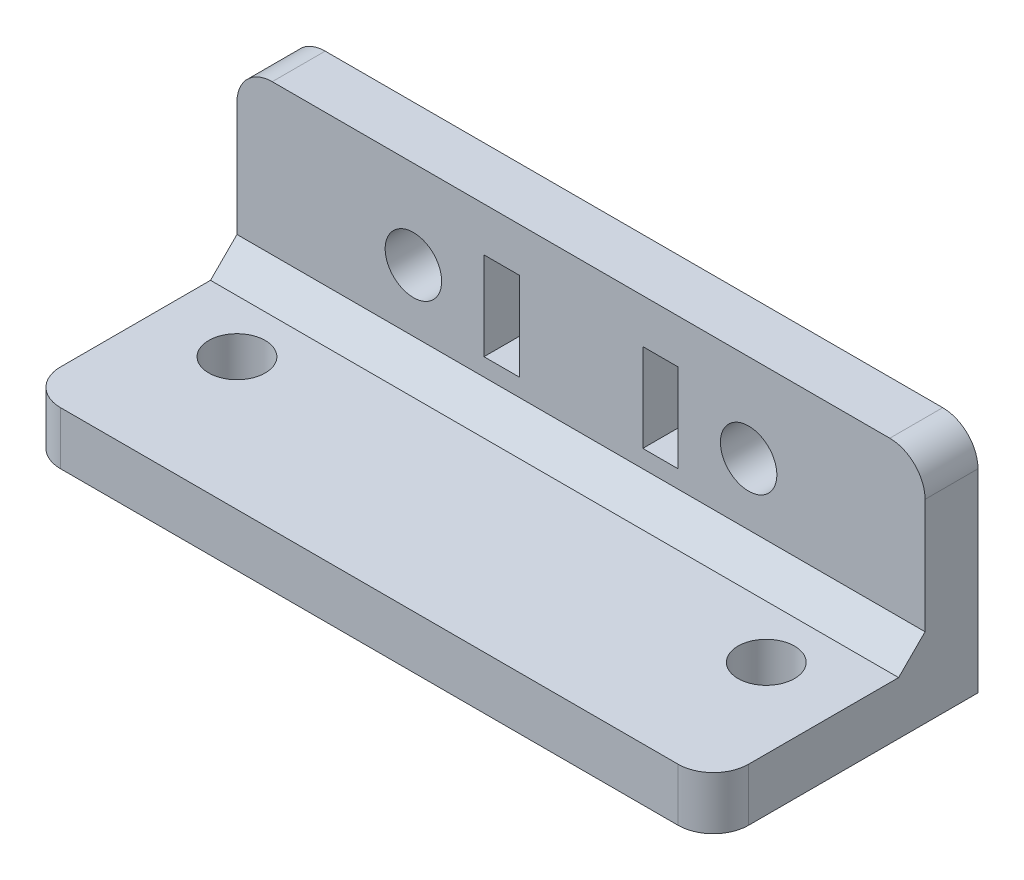
ISO-10303-21;
HEADER;
FILE_DESCRIPTION(('STEP AP214'),'2;1');
FILE_NAME('part.step','',(''),(''),'','','');
FILE_SCHEMA(('AUTOMOTIVE_DESIGN { 1 0 10303 214 1 1 1 1 }'));
ENDSEC;
DATA;
#1=APPLICATION_CONTEXT('core data for automotive mechanical design processes');
#2=APPLICATION_PROTOCOL_DEFINITION('international standard','automotive_design',2000,#1);
#3=PRODUCT_CONTEXT('',#1,'mechanical');
#4=PRODUCT('Part','Part','',(#3));
#5=PRODUCT_RELATED_PRODUCT_CATEGORY('part','',(#4));
#6=PRODUCT_DEFINITION_FORMATION('','',#4);
#7=PRODUCT_DEFINITION_CONTEXT('part definition',#1,'design');
#8=PRODUCT_DEFINITION('design','',#6,#7);
#9=PRODUCT_DEFINITION_SHAPE('','',#8);
#10=(LENGTH_UNIT() NAMED_UNIT(*) SI_UNIT(.MILLI.,.METRE.));
#11=(NAMED_UNIT(*) PLANE_ANGLE_UNIT() SI_UNIT($,.RADIAN.));
#12=(NAMED_UNIT(*) SI_UNIT($,.STERADIAN.) SOLID_ANGLE_UNIT());
#13=UNCERTAINTY_MEASURE_WITH_UNIT(LENGTH_MEASURE(1.E-05),#10,'distance_accuracy_value','');
#14=(GEOMETRIC_REPRESENTATION_CONTEXT(3) GLOBAL_UNCERTAINTY_ASSIGNED_CONTEXT((#13)) GLOBAL_UNIT_ASSIGNED_CONTEXT((#10,
#11,#12)) REPRESENTATION_CONTEXT('',''));
#15=CARTESIAN_POINT('',(0.,0.,0.));
#16=DIRECTION('',(0.,0.,1.));
#17=DIRECTION('',(1.,0.,0.));
#18=AXIS2_PLACEMENT_3D('',#15,#16,#17);
#19=CARTESIAN_POINT('',(0.,0.,3.));
#20=DIRECTION('',(0.,0.,1.));
#21=DIRECTION('',(1.,0.,0.));
#22=AXIS2_PLACEMENT_3D('',#19,#20,#21);
#23=PLANE('',#22);
#24=CARTESIAN_POINT('',(0.,0.,3.));
#25=DIRECTION('',(0.,0.,1.));
#26=DIRECTION('',(1.,0.,0.));
#27=AXIS2_PLACEMENT_3D('',#24,#25,#26);
#28=CIRCLE('',#27,1.6);
#29=CARTESIAN_POINT('',(1.6,0.,3.));
#30=VERTEX_POINT('',#29);
#31=EDGE_CURVE('E325',#30,#30,#28,.T.);
#32=ORIENTED_EDGE('',*,*,#31,.F.);
#33=EDGE_LOOP('',(#32));
#34=FACE_BOUND('',#33,.T.);
#35=DIRECTION('',(-1.,0.,0.));
#36=VECTOR('',#35,1.);
#37=CARTESIAN_POINT('',(-10.,5.,3.));
#38=LINE('',#37,#36);
#39=CARTESIAN_POINT('',(27.,4.99999999999999,3.));
#40=VERTEX_POINT('',#39);
#41=CARTESIAN_POINT('',(-8.,5.,3.));
#42=VERTEX_POINT('',#41);
#43=EDGE_CURVE('E332',#40,#42,#38,.T.);
#44=ORIENTED_EDGE('',*,*,#43,.T.);
#45=CARTESIAN_POINT('',(-8.,3.,3.));
#46=DIRECTION('',(0.,0.,1.));
#47=DIRECTION('',(1.,0.,0.));
#48=AXIS2_PLACEMENT_3D('',#45,#46,#47);
#49=CIRCLE('',#48,2.);
#50=CARTESIAN_POINT('',(-10.,3.,3.));
#51=VERTEX_POINT('',#50);
#52=EDGE_CURVE('E11',#42,#51,#49,.T.);
#53=ORIENTED_EDGE('',*,*,#52,.T.);
#54=DIRECTION('',(0.,-1.,0.));
#55=VECTOR('',#54,1.);
#56=CARTESIAN_POINT('',(-10.,-5.,3.));
#57=LINE('',#56,#55);
#58=CARTESIAN_POINT('',(-10.,-3.49999999999999,3.));
#59=VERTEX_POINT('',#58);
#60=EDGE_CURVE('E335',#51,#59,#57,.T.);
#61=ORIENTED_EDGE('',*,*,#60,.T.);
#62=DIRECTION('',(1.,0.,0.));
#63=VECTOR('',#62,1.);
#64=CARTESIAN_POINT('',(0.,-3.49999999999999,3.));
#65=LINE('',#64,#63);
#66=CARTESIAN_POINT('',(29.,-3.49999999999998,3.));
#67=VERTEX_POINT('',#66);
#68=EDGE_CURVE('E341',#59,#67,#65,.T.);
#69=ORIENTED_EDGE('',*,*,#68,.T.);
#70=DIRECTION('',(0.,1.,0.));
#71=VECTOR('',#70,1.);
#72=CARTESIAN_POINT('',(29.,-4.99999999999999,3.));
#73=LINE('',#72,#71);
#74=CARTESIAN_POINT('',(29.,2.99999999999999,3.));
#75=VERTEX_POINT('',#74);
#76=EDGE_CURVE('E338',#67,#75,#73,.T.);
#77=ORIENTED_EDGE('',*,*,#76,.T.);
#78=CARTESIAN_POINT('',(27.,2.99999999999999,3.));
#79=DIRECTION('',(0.,0.,1.));
#80=DIRECTION('',(1.,0.,0.));
#81=AXIS2_PLACEMENT_3D('',#78,#79,#80);
#82=CIRCLE('',#81,2.);
#83=EDGE_CURVE('E58',#75,#40,#82,.T.);
#84=ORIENTED_EDGE('',*,*,#83,.T.);
#85=EDGE_LOOP('',(#44,#53,#61,#69,#77,#84));
#86=FACE_BOUND('',#85,.T.);
#87=CARTESIAN_POINT('',(19.,0.,3.));
#88=DIRECTION('',(0.,0.,1.));
#89=DIRECTION('',(1.,0.,0.));
#90=AXIS2_PLACEMENT_3D('',#87,#88,#89);
#91=CIRCLE('',#90,1.6);
#92=CARTESIAN_POINT('',(20.6,0.,3.));
#93=VERTEX_POINT('',#92);
#94=EDGE_CURVE('E317',#93,#93,#91,.T.);
#95=ORIENTED_EDGE('',*,*,#94,.F.);
#96=EDGE_LOOP('',(#95));
#97=FACE_BOUND('',#96,.T.);
#98=DIRECTION('',(-1.,0.,0.));
#99=VECTOR('',#98,1.);
#100=CARTESIAN_POINT('',(13.,2.5,3.));
#101=LINE('',#100,#99);
#102=CARTESIAN_POINT('',(15.,2.5,3.));
#103=VERTEX_POINT('',#102);
#104=CARTESIAN_POINT('',(13.,2.5,3.));
#105=VERTEX_POINT('',#104);
#106=EDGE_CURVE('E277',#103,#105,#101,.T.);
#107=ORIENTED_EDGE('',*,*,#106,.F.);
#108=DIRECTION('',(0.,1.,0.));
#109=VECTOR('',#108,1.);
#110=CARTESIAN_POINT('',(15.,-2.5,3.));
#111=LINE('',#110,#109);
#112=CARTESIAN_POINT('',(15.,-2.5,3.));
#113=VERTEX_POINT('',#112);
#114=EDGE_CURVE('E274',#113,#103,#111,.T.);
#115=ORIENTED_EDGE('',*,*,#114,.F.);
#116=DIRECTION('',(1.,0.,0.));
#117=VECTOR('',#116,1.);
#118=CARTESIAN_POINT('',(13.,-2.5,3.));
#119=LINE('',#118,#117);
#120=CARTESIAN_POINT('',(13.,-2.5,3.));
#121=VERTEX_POINT('',#120);
#122=EDGE_CURVE('E285',#121,#113,#119,.T.);
#123=ORIENTED_EDGE('',*,*,#122,.F.);
#124=DIRECTION('',(0.,-1.,0.));
#125=VECTOR('',#124,1.);
#126=CARTESIAN_POINT('',(13.,-2.5,3.));
#127=LINE('',#126,#125);
#128=EDGE_CURVE('E281',#105,#121,#127,.T.);
#129=ORIENTED_EDGE('',*,*,#128,.F.);
#130=EDGE_LOOP('',(#107,#115,#123,#129));
#131=FACE_BOUND('',#130,.T.);
#132=DIRECTION('',(-1.,0.,0.));
#133=VECTOR('',#132,1.);
#134=CARTESIAN_POINT('',(4.,2.5,3.));
#135=LINE('',#134,#133);
#136=CARTESIAN_POINT('',(6.,2.5,3.));
#137=VERTEX_POINT('',#136);
#138=CARTESIAN_POINT('',(4.,2.5,3.));
#139=VERTEX_POINT('',#138);
#140=EDGE_CURVE('E238',#137,#139,#135,.T.);
#141=ORIENTED_EDGE('',*,*,#140,.F.);
#142=DIRECTION('',(0.,1.,0.));
#143=VECTOR('',#142,1.);
#144=CARTESIAN_POINT('',(6.,-2.5,3.));
#145=LINE('',#144,#143);
#146=CARTESIAN_POINT('',(6.,-2.5,3.));
#147=VERTEX_POINT('',#146);
#148=EDGE_CURVE('E235',#147,#137,#145,.T.);
#149=ORIENTED_EDGE('',*,*,#148,.F.);
#150=DIRECTION('',(1.,0.,0.));
#151=VECTOR('',#150,1.);
#152=CARTESIAN_POINT('',(4.,-2.5,3.));
#153=LINE('',#152,#151);
#154=CARTESIAN_POINT('',(4.,-2.5,3.));
#155=VERTEX_POINT('',#154);
#156=EDGE_CURVE('E246',#155,#147,#153,.T.);
#157=ORIENTED_EDGE('',*,*,#156,.F.);
#158=DIRECTION('',(0.,-1.,0.));
#159=VECTOR('',#158,1.);
#160=CARTESIAN_POINT('',(4.,-2.5,3.));
#161=LINE('',#160,#159);
#162=EDGE_CURVE('E242',#139,#155,#161,.T.);
#163=ORIENTED_EDGE('',*,*,#162,.F.);
#164=EDGE_LOOP('',(#141,#149,#157,#163));
#165=FACE_BOUND('',#164,.T.);
#166=ADVANCED_FACE('F49',(#34,#86,#97,#131,#165),#23,.T.);
#167=CARTESIAN_POINT('',(0.,0.,0.));
#168=DIRECTION('',(0.,0.,1.));
#169=DIRECTION('',(1.,0.,0.));
#170=AXIS2_PLACEMENT_3D('',#167,#168,#169);
#171=PLANE('',#170);
#172=DIRECTION('',(0.,1.,0.));
#173=VECTOR('',#172,1.);
#174=CARTESIAN_POINT('',(15.,-2.5,0.));
#175=LINE('',#174,#173);
#176=CARTESIAN_POINT('',(15.,-2.5,0.));
#177=VERTEX_POINT('',#176);
#178=CARTESIAN_POINT('',(15.,2.5,0.));
#179=VERTEX_POINT('',#178);
#180=EDGE_CURVE('E273',#177,#179,#175,.T.);
#181=ORIENTED_EDGE('',*,*,#180,.T.);
#182=DIRECTION('',(-1.,0.,0.));
#183=VECTOR('',#182,1.);
#184=CARTESIAN_POINT('',(13.,2.5,0.));
#185=LINE('',#184,#183);
#186=CARTESIAN_POINT('',(13.,2.5,0.));
#187=VERTEX_POINT('',#186);
#188=EDGE_CURVE('E292',#179,#187,#185,.T.);
#189=ORIENTED_EDGE('',*,*,#188,.T.);
#190=DIRECTION('',(0.,-1.,0.));
#191=VECTOR('',#190,1.);
#192=CARTESIAN_POINT('',(13.,-2.5,0.));
#193=LINE('',#192,#191);
#194=CARTESIAN_POINT('',(13.,-2.5,0.));
#195=VERTEX_POINT('',#194);
#196=EDGE_CURVE('E296',#187,#195,#193,.T.);
#197=ORIENTED_EDGE('',*,*,#196,.T.);
#198=DIRECTION('',(1.,0.,0.));
#199=VECTOR('',#198,1.);
#200=CARTESIAN_POINT('',(13.,-2.5,0.));
#201=LINE('',#200,#199);
#202=EDGE_CURVE('E278',#195,#177,#201,.T.);
#203=ORIENTED_EDGE('',*,*,#202,.T.);
#204=EDGE_LOOP('',(#181,#189,#197,#203));
#205=FACE_BOUND('',#204,.T.);
#206=DIRECTION('',(0.,-1.,0.));
#207=VECTOR('',#206,1.);
#208=CARTESIAN_POINT('',(-10.,-5.,0.));
#209=LINE('',#208,#207);
#210=CARTESIAN_POINT('',(-10.,3.,0.));
#211=VERTEX_POINT('',#210);
#212=CARTESIAN_POINT('',(-10.,-8.,0.));
#213=VERTEX_POINT('',#212);
#214=EDGE_CURVE('E200',#211,#213,#209,.T.);
#215=ORIENTED_EDGE('',*,*,#214,.F.);
#216=CARTESIAN_POINT('',(-8.,3.,0.));
#217=DIRECTION('',(0.,0.,1.));
#218=DIRECTION('',(1.,0.,0.));
#219=AXIS2_PLACEMENT_3D('',#216,#217,#218);
#220=CIRCLE('',#219,2.);
#221=CARTESIAN_POINT('',(-8.,5.,0.));
#222=VERTEX_POINT('',#221);
#223=EDGE_CURVE('E392',#211,#222,#220,.F.);
#224=ORIENTED_EDGE('',*,*,#223,.T.);
#225=DIRECTION('',(-1.,0.,0.));
#226=VECTOR('',#225,1.);
#227=CARTESIAN_POINT('',(-10.,5.,0.));
#228=LINE('',#227,#226);
#229=CARTESIAN_POINT('',(27.,4.99999999999999,0.));
#230=VERTEX_POINT('',#229);
#231=EDGE_CURVE('E208',#230,#222,#228,.T.);
#232=ORIENTED_EDGE('',*,*,#231,.F.);
#233=CARTESIAN_POINT('',(27.,2.99999999999999,0.));
#234=DIRECTION('',(0.,0.,1.));
#235=DIRECTION('',(1.,0.,0.));
#236=AXIS2_PLACEMENT_3D('',#233,#234,#235);
#237=CIRCLE('',#236,2.);
#238=CARTESIAN_POINT('',(29.,2.99999999999999,0.));
#239=VERTEX_POINT('',#238);
#240=EDGE_CURVE('E389',#230,#239,#237,.F.);
#241=ORIENTED_EDGE('',*,*,#240,.T.);
#242=DIRECTION('',(0.,1.,0.));
#243=VECTOR('',#242,1.);
#244=CARTESIAN_POINT('',(29.,-4.99999999999999,0.));
#245=LINE('',#244,#243);
#246=CARTESIAN_POINT('',(29.,-7.99999999999999,0.));
#247=VERTEX_POINT('',#246);
#248=EDGE_CURVE('E207',#247,#239,#245,.T.);
#249=ORIENTED_EDGE('',*,*,#248,.F.);
#250=DIRECTION('',(1.,0.,0.));
#251=VECTOR('',#250,1.);
#252=CARTESIAN_POINT('',(29.,-7.99999999999999,0.));
#253=LINE('',#252,#251);
#254=EDGE_CURVE('E188',#213,#247,#253,.T.);
#255=ORIENTED_EDGE('',*,*,#254,.F.);
#256=EDGE_LOOP('',(#215,#224,#232,#241,#249,#255));
#257=FACE_BOUND('',#256,.T.);
#258=CARTESIAN_POINT('',(0.,0.,0.));
#259=DIRECTION('',(0.,0.,1.));
#260=DIRECTION('',(1.,0.,0.));
#261=AXIS2_PLACEMENT_3D('',#258,#259,#260);
#262=CIRCLE('',#261,1.6);
#263=CARTESIAN_POINT('',(1.6,0.,0.));
#264=VERTEX_POINT('',#263);
#265=EDGE_CURVE('E321',#264,#264,#262,.T.);
#266=ORIENTED_EDGE('',*,*,#265,.T.);
#267=EDGE_LOOP('',(#266));
#268=FACE_BOUND('',#267,.T.);
#269=CARTESIAN_POINT('',(19.,0.,0.));
#270=DIRECTION('',(0.,0.,1.));
#271=DIRECTION('',(1.,0.,0.));
#272=AXIS2_PLACEMENT_3D('',#269,#270,#271);
#273=CIRCLE('',#272,1.6);
#274=CARTESIAN_POINT('',(20.6,0.,0.));
#275=VERTEX_POINT('',#274);
#276=EDGE_CURVE('E316',#275,#275,#273,.T.);
#277=ORIENTED_EDGE('',*,*,#276,.T.);
#278=EDGE_LOOP('',(#277));
#279=FACE_BOUND('',#278,.T.);
#280=DIRECTION('',(0.,1.,0.));
#281=VECTOR('',#280,1.);
#282=CARTESIAN_POINT('',(6.,-2.5,0.));
#283=LINE('',#282,#281);
#284=CARTESIAN_POINT('',(6.,-2.5,0.));
#285=VERTEX_POINT('',#284);
#286=CARTESIAN_POINT('',(6.,2.5,0.));
#287=VERTEX_POINT('',#286);
#288=EDGE_CURVE('E214',#285,#287,#283,.T.);
#289=ORIENTED_EDGE('',*,*,#288,.T.);
#290=DIRECTION('',(-1.,0.,0.));
#291=VECTOR('',#290,1.);
#292=CARTESIAN_POINT('',(4.,2.5,0.));
#293=LINE('',#292,#291);
#294=CARTESIAN_POINT('',(4.,2.5,0.));
#295=VERTEX_POINT('',#294);
#296=EDGE_CURVE('E218',#287,#295,#293,.T.);
#297=ORIENTED_EDGE('',*,*,#296,.T.);
#298=DIRECTION('',(0.,-1.,0.));
#299=VECTOR('',#298,1.);
#300=CARTESIAN_POINT('',(4.,-2.5,0.));
#301=LINE('',#300,#299);
#302=CARTESIAN_POINT('',(4.,-2.5,0.));
#303=VERTEX_POINT('',#302);
#304=EDGE_CURVE('E253',#295,#303,#301,.T.);
#305=ORIENTED_EDGE('',*,*,#304,.T.);
#306=DIRECTION('',(1.,0.,0.));
#307=VECTOR('',#306,1.);
#308=CARTESIAN_POINT('',(4.,-2.5,0.));
#309=LINE('',#308,#307);
#310=EDGE_CURVE('E239',#303,#285,#309,.T.);
#311=ORIENTED_EDGE('',*,*,#310,.T.);
#312=EDGE_LOOP('',(#289,#297,#305,#311));
#313=FACE_BOUND('',#312,.T.);
#314=ADVANCED_FACE('F210',(#205,#257,#268,#279,#313),#171,.F.);
#315=CARTESIAN_POINT('',(-10.,5.,3.));
#316=DIRECTION('',(0.,-1.,0.));
#317=DIRECTION('',(1.,0.,0.));
#318=AXIS2_PLACEMENT_3D('',#315,#316,#317);
#319=PLANE('',#318);
#320=ORIENTED_EDGE('',*,*,#231,.T.);
#321=DIRECTION('',(0.,0.,-1.));
#322=VECTOR('',#321,1.);
#323=CARTESIAN_POINT('',(-8.,5.,3.));
#324=LINE('',#323,#322);
#325=EDGE_CURVE('E65',#222,#42,#324,.F.);
#326=ORIENTED_EDGE('',*,*,#325,.T.);
#327=ORIENTED_EDGE('',*,*,#43,.F.);
#328=DIRECTION('',(0.,0.,-1.));
#329=VECTOR('',#328,1.);
#330=CARTESIAN_POINT('',(27.,4.99999999999999,3.));
#331=LINE('',#330,#329);
#332=EDGE_CURVE('E395',#40,#230,#331,.T.);
#333=ORIENTED_EDGE('',*,*,#332,.T.);
#334=EDGE_LOOP('',(#320,#326,#327,#333));
#335=FACE_BOUND('',#334,.T.);
#336=ADVANCED_FACE('F403',(#335),#319,.F.);
#337=CARTESIAN_POINT('',(-10.,-5.,3.));
#338=DIRECTION('',(1.,0.,0.));
#339=DIRECTION('',(0.,1.,0.));
#340=AXIS2_PLACEMENT_3D('',#337,#338,#339);
#341=PLANE('',#340);
#342=DIRECTION('',(0.,0.,-1.));
#343=VECTOR('',#342,1.);
#344=CARTESIAN_POINT('',(-10.,-8.,0.));
#345=LINE('',#344,#343);
#346=CARTESIAN_POINT('',(-10.,-8.,13.));
#347=VERTEX_POINT('',#346);
#348=EDGE_CURVE('E181',#347,#213,#345,.T.);
#349=ORIENTED_EDGE('',*,*,#348,.F.);
#350=DIRECTION('',(0.,1.,0.));
#351=VECTOR('',#350,1.);
#352=CARTESIAN_POINT('',(-10.,-5.,13.));
#353=LINE('',#352,#351);
#354=CARTESIAN_POINT('',(-10.,-5.,13.));
#355=VERTEX_POINT('',#354);
#356=EDGE_CURVE('E362',#347,#355,#353,.T.);
#357=ORIENTED_EDGE('',*,*,#356,.T.);
#358=DIRECTION('',(0.,0.,-1.));
#359=VECTOR('',#358,1.);
#360=CARTESIAN_POINT('',(-10.,-5.,0.));
#361=LINE('',#360,#359);
#362=CARTESIAN_POINT('',(-10.,-5.,4.49999999999999));
#363=VERTEX_POINT('',#362);
#364=EDGE_CURVE('E231',#355,#363,#361,.T.);
#365=ORIENTED_EDGE('',*,*,#364,.T.);
#366=DIRECTION('',(0.,0.707106781186552,-0.707106781186543));
#367=VECTOR('',#366,1.);
#368=CARTESIAN_POINT('',(-10.,-4.25000000000001,3.75000000000001));
#369=LINE('',#368,#367);
#370=EDGE_CURVE('E356',#363,#59,#369,.T.);
#371=ORIENTED_EDGE('',*,*,#370,.T.);
#372=ORIENTED_EDGE('',*,*,#60,.F.);
#373=DIRECTION('',(0.,0.,-1.));
#374=VECTOR('',#373,1.);
#375=CARTESIAN_POINT('',(-10.,3.,3.));
#376=LINE('',#375,#374);
#377=EDGE_CURVE('E204',#51,#211,#376,.T.);
#378=ORIENTED_EDGE('',*,*,#377,.T.);
#379=ORIENTED_EDGE('',*,*,#214,.T.);
#380=EDGE_LOOP('',(#349,#357,#365,#371,#372,#378,#379));
#381=FACE_BOUND('',#380,.T.);
#382=ADVANCED_FACE('F201',(#381),#341,.F.);
#383=CARTESIAN_POINT('',(29.,-4.99999999999999,3.));
#384=DIRECTION('',(-1.,0.,0.));
#385=DIRECTION('',(0.,-1.,0.));
#386=AXIS2_PLACEMENT_3D('',#383,#384,#385);
#387=PLANE('',#386);
#388=DIRECTION('',(0.,0.,1.));
#389=VECTOR('',#388,1.);
#390=CARTESIAN_POINT('',(29.,-4.99999999999999,0.));
#391=LINE('',#390,#389);
#392=CARTESIAN_POINT('',(29.,-4.99999999999999,4.49999999999999));
#393=VERTEX_POINT('',#392);
#394=CARTESIAN_POINT('',(29.,-4.99999999999999,13.));
#395=VERTEX_POINT('',#394);
#396=EDGE_CURVE('E222',#393,#395,#391,.T.);
#397=ORIENTED_EDGE('',*,*,#396,.T.);
#398=DIRECTION('',(0.,1.,0.));
#399=VECTOR('',#398,1.);
#400=CARTESIAN_POINT('',(29.,-4.99999999999999,13.));
#401=LINE('',#400,#399);
#402=CARTESIAN_POINT('',(29.,-7.99999999999999,13.));
#403=VERTEX_POINT('',#402);
#404=EDGE_CURVE('E386',#395,#403,#401,.F.);
#405=ORIENTED_EDGE('',*,*,#404,.T.);
#406=DIRECTION('',(0.,0.,1.));
#407=VECTOR('',#406,1.);
#408=CARTESIAN_POINT('',(29.,-7.99999999999999,0.));
#409=LINE('',#408,#407);
#410=EDGE_CURVE('E234',#247,#403,#409,.T.);
#411=ORIENTED_EDGE('',*,*,#410,.F.);
#412=ORIENTED_EDGE('',*,*,#248,.T.);
#413=DIRECTION('',(0.,0.,-1.));
#414=VECTOR('',#413,1.);
#415=CARTESIAN_POINT('',(29.,2.99999999999999,3.));
#416=LINE('',#415,#414);
#417=EDGE_CURVE('E383',#239,#75,#416,.F.);
#418=ORIENTED_EDGE('',*,*,#417,.T.);
#419=ORIENTED_EDGE('',*,*,#76,.F.);
#420=DIRECTION('',(0.,-0.707106781186552,0.707106781186543));
#421=VECTOR('',#420,1.);
#422=CARTESIAN_POINT('',(29.,-4.25,3.75));
#423=LINE('',#422,#421);
#424=EDGE_CURVE('E353',#67,#393,#423,.T.);
#425=ORIENTED_EDGE('',*,*,#424,.T.);
#426=EDGE_LOOP('',(#397,#405,#411,#412,#418,#419,#425));
#427=FACE_BOUND('',#426,.T.);
#428=ADVANCED_FACE('F417',(#427),#387,.F.);
#429=CARTESIAN_POINT('',(0.,0.,3.));
#430=DIRECTION('',(0.,0.,-1.));
#431=DIRECTION('',(-1.,0.,0.));
#432=AXIS2_PLACEMENT_3D('',#429,#430,#431);
#433=CYLINDRICAL_SURFACE('',#432,1.6);
#434=ORIENTED_EDGE('',*,*,#31,.T.);
#435=EDGE_LOOP('',(#434));
#436=FACE_BOUND('',#435,.T.);
#437=ORIENTED_EDGE('',*,*,#265,.F.);
#438=EDGE_LOOP('',(#437));
#439=FACE_BOUND('',#438,.T.);
#440=ADVANCED_FACE('F436',(#436,#439),#433,.F.);
#441=CARTESIAN_POINT('',(19.,0.,3.));
#442=DIRECTION('',(0.,0.,-1.));
#443=DIRECTION('',(-1.,0.,0.));
#444=AXIS2_PLACEMENT_3D('',#441,#442,#443);
#445=CYLINDRICAL_SURFACE('',#444,1.6);
#446=ORIENTED_EDGE('',*,*,#94,.T.);
#447=EDGE_LOOP('',(#446));
#448=FACE_BOUND('',#447,.T.);
#449=ORIENTED_EDGE('',*,*,#276,.F.);
#450=EDGE_LOOP('',(#449));
#451=FACE_BOUND('',#450,.T.);
#452=ADVANCED_FACE('F533',(#448,#451),#445,.F.);
#453=CARTESIAN_POINT('',(15.,-2.5,3.));
#454=DIRECTION('',(-1.,0.,0.));
#455=DIRECTION('',(0.,0.,1.));
#456=AXIS2_PLACEMENT_3D('',#453,#454,#455);
#457=PLANE('',#456);
#458=ORIENTED_EDGE('',*,*,#180,.F.);
#459=DIRECTION('',(0.,0.,-1.));
#460=VECTOR('',#459,1.);
#461=CARTESIAN_POINT('',(15.,-2.5,3.));
#462=LINE('',#461,#460);
#463=EDGE_CURVE('E288',#113,#177,#462,.T.);
#464=ORIENTED_EDGE('',*,*,#463,.F.);
#465=ORIENTED_EDGE('',*,*,#114,.T.);
#466=DIRECTION('',(0.,0.,-1.));
#467=VECTOR('',#466,1.);
#468=CARTESIAN_POINT('',(15.,2.5,3.));
#469=LINE('',#468,#467);
#470=EDGE_CURVE('E312',#103,#179,#469,.T.);
#471=ORIENTED_EDGE('',*,*,#470,.T.);
#472=EDGE_LOOP('',(#458,#464,#465,#471));
#473=FACE_BOUND('',#472,.T.);
#474=ADVANCED_FACE('F530',(#473),#457,.T.);
#475=CARTESIAN_POINT('',(13.,2.5,3.));
#476=DIRECTION('',(0.,-1.,0.));
#477=DIRECTION('',(0.,0.,-1.));
#478=AXIS2_PLACEMENT_3D('',#475,#476,#477);
#479=PLANE('',#478);
#480=ORIENTED_EDGE('',*,*,#188,.F.);
#481=ORIENTED_EDGE('',*,*,#470,.F.);
#482=ORIENTED_EDGE('',*,*,#106,.T.);
#483=DIRECTION('',(0.,0.,-1.));
#484=VECTOR('',#483,1.);
#485=CARTESIAN_POINT('',(13.,2.5,3.));
#486=LINE('',#485,#484);
#487=EDGE_CURVE('E309',#105,#187,#486,.T.);
#488=ORIENTED_EDGE('',*,*,#487,.T.);
#489=EDGE_LOOP('',(#480,#481,#482,#488));
#490=FACE_BOUND('',#489,.T.);
#491=ADVANCED_FACE('F526',(#490),#479,.T.);
#492=CARTESIAN_POINT('',(13.,-2.5,3.));
#493=DIRECTION('',(1.,0.,0.));
#494=DIRECTION('',(0.,0.,-1.));
#495=AXIS2_PLACEMENT_3D('',#492,#493,#494);
#496=PLANE('',#495);
#497=ORIENTED_EDGE('',*,*,#196,.F.);
#498=ORIENTED_EDGE('',*,*,#487,.F.);
#499=ORIENTED_EDGE('',*,*,#128,.T.);
#500=DIRECTION('',(0.,0.,-1.));
#501=VECTOR('',#500,1.);
#502=CARTESIAN_POINT('',(13.,-2.5,3.));
#503=LINE('',#502,#501);
#504=EDGE_CURVE('E306',#121,#195,#503,.T.);
#505=ORIENTED_EDGE('',*,*,#504,.T.);
#506=EDGE_LOOP('',(#497,#498,#499,#505));
#507=FACE_BOUND('',#506,.T.);
#508=ADVANCED_FACE('F522',(#507),#496,.T.);
#509=CARTESIAN_POINT('',(13.,-2.5,3.));
#510=DIRECTION('',(0.,1.,0.));
#511=DIRECTION('',(0.,0.,1.));
#512=AXIS2_PLACEMENT_3D('',#509,#510,#511);
#513=PLANE('',#512);
#514=ORIENTED_EDGE('',*,*,#202,.F.);
#515=ORIENTED_EDGE('',*,*,#504,.F.);
#516=ORIENTED_EDGE('',*,*,#122,.T.);
#517=ORIENTED_EDGE('',*,*,#463,.T.);
#518=EDGE_LOOP('',(#514,#515,#516,#517));
#519=FACE_BOUND('',#518,.T.);
#520=ADVANCED_FACE('F518',(#519),#513,.T.);
#521=CARTESIAN_POINT('',(6.,-2.5,3.));
#522=DIRECTION('',(-1.,0.,0.));
#523=DIRECTION('',(0.,0.,1.));
#524=AXIS2_PLACEMENT_3D('',#521,#522,#523);
#525=PLANE('',#524);
#526=ORIENTED_EDGE('',*,*,#288,.F.);
#527=DIRECTION('',(0.,0.,-1.));
#528=VECTOR('',#527,1.);
#529=CARTESIAN_POINT('',(6.,-2.5,3.));
#530=LINE('',#529,#528);
#531=EDGE_CURVE('E248',#147,#285,#530,.T.);
#532=ORIENTED_EDGE('',*,*,#531,.F.);
#533=ORIENTED_EDGE('',*,*,#148,.T.);
#534=DIRECTION('',(0.,0.,-1.));
#535=VECTOR('',#534,1.);
#536=CARTESIAN_POINT('',(6.,2.5,3.));
#537=LINE('',#536,#535);
#538=EDGE_CURVE('E269',#137,#287,#537,.T.);
#539=ORIENTED_EDGE('',*,*,#538,.T.);
#540=EDGE_LOOP('',(#526,#532,#533,#539));
#541=FACE_BOUND('',#540,.T.);
#542=ADVANCED_FACE('F514',(#541),#525,.T.);
#543=CARTESIAN_POINT('',(4.,2.5,3.));
#544=DIRECTION('',(0.,-1.,0.));
#545=DIRECTION('',(0.,0.,-1.));
#546=AXIS2_PLACEMENT_3D('',#543,#544,#545);
#547=PLANE('',#546);
#548=ORIENTED_EDGE('',*,*,#296,.F.);
#549=ORIENTED_EDGE('',*,*,#538,.F.);
#550=ORIENTED_EDGE('',*,*,#140,.T.);
#551=DIRECTION('',(0.,0.,-1.));
#552=VECTOR('',#551,1.);
#553=CARTESIAN_POINT('',(4.,2.5,3.));
#554=LINE('',#553,#552);
#555=EDGE_CURVE('E266',#139,#295,#554,.T.);
#556=ORIENTED_EDGE('',*,*,#555,.T.);
#557=EDGE_LOOP('',(#548,#549,#550,#556));
#558=FACE_BOUND('',#557,.T.);
#559=ADVANCED_FACE('F510',(#558),#547,.T.);
#560=CARTESIAN_POINT('',(4.,-2.5,3.));
#561=DIRECTION('',(1.,0.,0.));
#562=DIRECTION('',(0.,0.,-1.));
#563=AXIS2_PLACEMENT_3D('',#560,#561,#562);
#564=PLANE('',#563);
#565=ORIENTED_EDGE('',*,*,#304,.F.);
#566=ORIENTED_EDGE('',*,*,#555,.F.);
#567=ORIENTED_EDGE('',*,*,#162,.T.);
#568=DIRECTION('',(0.,0.,-1.));
#569=VECTOR('',#568,1.);
#570=CARTESIAN_POINT('',(4.,-2.5,3.));
#571=LINE('',#570,#569);
#572=EDGE_CURVE('E263',#155,#303,#571,.T.);
#573=ORIENTED_EDGE('',*,*,#572,.T.);
#574=EDGE_LOOP('',(#565,#566,#567,#573));
#575=FACE_BOUND('',#574,.T.);
#576=ADVANCED_FACE('F498',(#575),#564,.T.);
#577=CARTESIAN_POINT('',(4.,-2.5,3.));
#578=DIRECTION('',(0.,1.,0.));
#579=DIRECTION('',(0.,0.,1.));
#580=AXIS2_PLACEMENT_3D('',#577,#578,#579);
#581=PLANE('',#580);
#582=ORIENTED_EDGE('',*,*,#310,.F.);
#583=ORIENTED_EDGE('',*,*,#572,.F.);
#584=ORIENTED_EDGE('',*,*,#156,.T.);
#585=ORIENTED_EDGE('',*,*,#531,.T.);
#586=EDGE_LOOP('',(#582,#583,#584,#585));
#587=FACE_BOUND('',#586,.T.);
#588=ADVANCED_FACE('F489',(#587),#581,.T.);
#589=CARTESIAN_POINT('',(0.,-8.,0.));
#590=DIRECTION('',(0.,-1.,0.));
#591=DIRECTION('',(1.,0.,0.));
#592=AXIS2_PLACEMENT_3D('',#589,#590,#591);
#593=PLANE('',#592);
#594=CARTESIAN_POINT('',(-5.5,-8.,7.5));
#595=DIRECTION('',(0.,-1.,0.));
#596=DIRECTION('',(1.,0.,0.));
#597=AXIS2_PLACEMENT_3D('',#594,#595,#596);
#598=CIRCLE('',#597,1.6);
#599=CARTESIAN_POINT('',(-3.9,-8.,7.5));
#600=VERTEX_POINT('',#599);
#601=EDGE_CURVE('E227',#600,#600,#598,.T.);
#602=ORIENTED_EDGE('',*,*,#601,.F.);
#603=EDGE_LOOP('',(#602));
#604=FACE_BOUND('',#603,.T.);
#605=DIRECTION('',(-1.,0.,0.));
#606=VECTOR('',#605,1.);
#607=CARTESIAN_POINT('',(29.,-7.99999999999999,15.));
#608=LINE('',#607,#606);
#609=CARTESIAN_POINT('',(27.,-7.99999999999999,15.));
#610=VERTEX_POINT('',#609);
#611=CARTESIAN_POINT('',(-8.,-8.,15.));
#612=VERTEX_POINT('',#611);
#613=EDGE_CURVE('E196',#610,#612,#608,.T.);
#614=ORIENTED_EDGE('',*,*,#613,.T.);
#615=CARTESIAN_POINT('',(-8.,-8.,13.));
#616=DIRECTION('',(0.,-1.,0.));
#617=DIRECTION('',(1.,0.,0.));
#618=AXIS2_PLACEMENT_3D('',#615,#616,#617);
#619=CIRCLE('',#618,2.);
#620=EDGE_CURVE('E191',#612,#347,#619,.T.);
#621=ORIENTED_EDGE('',*,*,#620,.T.);
#622=ORIENTED_EDGE('',*,*,#348,.T.);
#623=ORIENTED_EDGE('',*,*,#254,.T.);
#624=ORIENTED_EDGE('',*,*,#410,.T.);
#625=CARTESIAN_POINT('',(27.,-7.99999999999999,13.));
#626=DIRECTION('',(0.,-1.,0.));
#627=DIRECTION('',(1.,0.,0.));
#628=AXIS2_PLACEMENT_3D('',#625,#626,#627);
#629=CIRCLE('',#628,2.);
#630=EDGE_CURVE('E378',#403,#610,#629,.T.);
#631=ORIENTED_EDGE('',*,*,#630,.T.);
#632=EDGE_LOOP('',(#614,#621,#622,#623,#624,#631));
#633=FACE_BOUND('',#632,.T.);
#634=CARTESIAN_POINT('',(24.5,-7.99999999999999,7.5));
#635=DIRECTION('',(0.,-1.,0.));
#636=DIRECTION('',(1.,0.,0.));
#637=AXIS2_PLACEMENT_3D('',#634,#635,#636);
#638=CIRCLE('',#637,1.6);
#639=CARTESIAN_POINT('',(26.1,-7.99999999999999,7.5));
#640=VERTEX_POINT('',#639);
#641=EDGE_CURVE('E474',#640,#640,#638,.T.);
#642=ORIENTED_EDGE('',*,*,#641,.F.);
#643=EDGE_LOOP('',(#642));
#644=FACE_BOUND('',#643,.T.);
#645=ADVANCED_FACE('F184',(#604,#633,#644),#593,.T.);
#646=CARTESIAN_POINT('',(0.,-5.,0.));
#647=DIRECTION('',(0.,-1.,0.));
#648=DIRECTION('',(1.,0.,0.));
#649=AXIS2_PLACEMENT_3D('',#646,#647,#648);
#650=PLANE('',#649);
#651=ORIENTED_EDGE('',*,*,#364,.F.);
#652=CARTESIAN_POINT('',(-8.,-5.,13.));
#653=DIRECTION('',(0.,-1.,0.));
#654=DIRECTION('',(1.,0.,0.));
#655=AXIS2_PLACEMENT_3D('',#652,#653,#654);
#656=CIRCLE('',#655,2.);
#657=CARTESIAN_POINT('',(-8.,-5.,15.));
#658=VERTEX_POINT('',#657);
#659=EDGE_CURVE('E368',#355,#658,#656,.F.);
#660=ORIENTED_EDGE('',*,*,#659,.T.);
#661=DIRECTION('',(-1.,0.,0.));
#662=VECTOR('',#661,1.);
#663=CARTESIAN_POINT('',(29.,-4.99999999999999,15.));
#664=LINE('',#663,#662);
#665=CARTESIAN_POINT('',(27.,-4.99999999999999,15.));
#666=VERTEX_POINT('',#665);
#667=EDGE_CURVE('E226',#666,#658,#664,.T.);
#668=ORIENTED_EDGE('',*,*,#667,.F.);
#669=CARTESIAN_POINT('',(27.,-4.99999999999999,13.));
#670=DIRECTION('',(0.,-1.,0.));
#671=DIRECTION('',(1.,0.,0.));
#672=AXIS2_PLACEMENT_3D('',#669,#670,#671);
#673=CIRCLE('',#672,2.);
#674=EDGE_CURVE('E365',#666,#395,#673,.F.);
#675=ORIENTED_EDGE('',*,*,#674,.T.);
#676=ORIENTED_EDGE('',*,*,#396,.F.);
#677=DIRECTION('',(-1.,0.,0.));
#678=VECTOR('',#677,1.);
#679=CARTESIAN_POINT('',(0.,-5.,4.49999999999999));
#680=LINE('',#679,#678);
#681=EDGE_CURVE('E349',#393,#363,#680,.T.);
#682=ORIENTED_EDGE('',*,*,#681,.T.);
#683=EDGE_LOOP('',(#651,#660,#668,#675,#676,#682));
#684=FACE_BOUND('',#683,.T.);
#685=CARTESIAN_POINT('',(-5.5,-5.,7.5));
#686=DIRECTION('',(0.,-1.,0.));
#687=DIRECTION('',(1.,0.,0.));
#688=AXIS2_PLACEMENT_3D('',#685,#686,#687);
#689=CIRCLE('',#688,1.6);
#690=CARTESIAN_POINT('',(-3.9,-5.,7.5));
#691=VERTEX_POINT('',#690);
#692=EDGE_CURVE('E470',#691,#691,#689,.T.);
#693=ORIENTED_EDGE('',*,*,#692,.T.);
#694=EDGE_LOOP('',(#693));
#695=FACE_BOUND('',#694,.T.);
#696=CARTESIAN_POINT('',(24.5,-4.99999999999999,7.5));
#697=DIRECTION('',(0.,-1.,0.));
#698=DIRECTION('',(1.,0.,0.));
#699=AXIS2_PLACEMENT_3D('',#696,#697,#698);
#700=CIRCLE('',#699,1.6);
#701=CARTESIAN_POINT('',(26.1,-4.99999999999999,7.5));
#702=VERTEX_POINT('',#701);
#703=EDGE_CURVE('E478',#702,#702,#700,.T.);
#704=ORIENTED_EDGE('',*,*,#703,.T.);
#705=EDGE_LOOP('',(#704));
#706=FACE_BOUND('',#705,.T.);
#707=ADVANCED_FACE('F488',(#684,#695,#706),#650,.F.);
#708=CARTESIAN_POINT('',(29.,-7.99999999999999,15.));
#709=DIRECTION('',(0.,0.,-1.));
#710=DIRECTION('',(-1.,0.,0.));
#711=AXIS2_PLACEMENT_3D('',#708,#709,#710);
#712=PLANE('',#711);
#713=ORIENTED_EDGE('',*,*,#667,.T.);
#714=DIRECTION('',(0.,1.,0.));
#715=VECTOR('',#714,1.);
#716=CARTESIAN_POINT('',(-8.,-8.,15.));
#717=LINE('',#716,#715);
#718=EDGE_CURVE('E375',#658,#612,#717,.F.);
#719=ORIENTED_EDGE('',*,*,#718,.T.);
#720=ORIENTED_EDGE('',*,*,#613,.F.);
#721=DIRECTION('',(0.,1.,0.));
#722=VECTOR('',#721,1.);
#723=CARTESIAN_POINT('',(27.,-7.99999999999999,15.));
#724=LINE('',#723,#722);
#725=EDGE_CURVE('E371',#610,#666,#724,.T.);
#726=ORIENTED_EDGE('',*,*,#725,.T.);
#727=EDGE_LOOP('',(#713,#719,#720,#726));
#728=FACE_BOUND('',#727,.T.);
#729=ADVANCED_FACE('F463',(#728),#712,.F.);
#730=CARTESIAN_POINT('',(-5.5,-8.,7.5));
#731=DIRECTION('',(0.,1.,0.));
#732=DIRECTION('',(-1.,0.,0.));
#733=AXIS2_PLACEMENT_3D('',#730,#731,#732);
#734=CYLINDRICAL_SURFACE('',#733,1.6);
#735=ORIENTED_EDGE('',*,*,#601,.T.);
#736=EDGE_LOOP('',(#735));
#737=FACE_BOUND('',#736,.T.);
#738=ORIENTED_EDGE('',*,*,#692,.F.);
#739=EDGE_LOOP('',(#738));
#740=FACE_BOUND('',#739,.T.);
#741=ADVANCED_FACE('F503',(#737,#740),#734,.F.);
#742=CARTESIAN_POINT('',(24.5,-7.99999999999999,7.5));
#743=DIRECTION('',(0.,1.,0.));
#744=DIRECTION('',(-1.,0.,0.));
#745=AXIS2_PLACEMENT_3D('',#742,#743,#744);
#746=CYLINDRICAL_SURFACE('',#745,1.6);
#747=ORIENTED_EDGE('',*,*,#641,.T.);
#748=EDGE_LOOP('',(#747));
#749=FACE_BOUND('',#748,.T.);
#750=ORIENTED_EDGE('',*,*,#703,.F.);
#751=EDGE_LOOP('',(#750));
#752=FACE_BOUND('',#751,.T.);
#753=ADVANCED_FACE('F450',(#749,#752),#746,.F.);
#754=CARTESIAN_POINT('',(0.,-3.49999999999999,3.));
#755=DIRECTION('',(0.,-0.707106781186543,-0.707106781186552));
#756=DIRECTION('',(1.,0.,0.));
#757=AXIS2_PLACEMENT_3D('',#754,#755,#756);
#758=PLANE('',#757);
#759=ORIENTED_EDGE('',*,*,#370,.F.);
#760=ORIENTED_EDGE('',*,*,#681,.F.);
#761=ORIENTED_EDGE('',*,*,#424,.F.);
#762=ORIENTED_EDGE('',*,*,#68,.F.);
#763=EDGE_LOOP('',(#759,#760,#761,#762));
#764=FACE_BOUND('',#763,.T.);
#765=ADVANCED_FACE('F414',(#764),#758,.F.);
#766=CARTESIAN_POINT('',(-8.,-5.,13.));
#767=DIRECTION('',(0.,1.,0.));
#768=DIRECTION('',(-1.,0.,0.));
#769=AXIS2_PLACEMENT_3D('',#766,#767,#768);
#770=CYLINDRICAL_SURFACE('',#769,2.);
#771=ORIENTED_EDGE('',*,*,#620,.F.);
#772=ORIENTED_EDGE('',*,*,#718,.F.);
#773=ORIENTED_EDGE('',*,*,#659,.F.);
#774=ORIENTED_EDGE('',*,*,#356,.F.);
#775=EDGE_LOOP('',(#771,#772,#773,#774));
#776=FACE_BOUND('',#775,.T.);
#777=ADVANCED_FACE('F449',(#776),#770,.T.);
#778=CARTESIAN_POINT('',(27.,-7.99999999999999,13.));
#779=DIRECTION('',(0.,1.,0.));
#780=DIRECTION('',(-1.,0.,0.));
#781=AXIS2_PLACEMENT_3D('',#778,#779,#780);
#782=CYLINDRICAL_SURFACE('',#781,2.);
#783=ORIENTED_EDGE('',*,*,#630,.F.);
#784=ORIENTED_EDGE('',*,*,#404,.F.);
#785=ORIENTED_EDGE('',*,*,#674,.F.);
#786=ORIENTED_EDGE('',*,*,#725,.F.);
#787=EDGE_LOOP('',(#783,#784,#785,#786));
#788=FACE_BOUND('',#787,.T.);
#789=ADVANCED_FACE('F424',(#788),#782,.T.);
#790=CARTESIAN_POINT('',(-8.,3.,3.));
#791=DIRECTION('',(0.,0.,-1.));
#792=DIRECTION('',(-1.,0.,0.));
#793=AXIS2_PLACEMENT_3D('',#790,#791,#792);
#794=CYLINDRICAL_SURFACE('',#793,2.);
#795=ORIENTED_EDGE('',*,*,#52,.F.);
#796=ORIENTED_EDGE('',*,*,#325,.F.);
#797=ORIENTED_EDGE('',*,*,#223,.F.);
#798=ORIENTED_EDGE('',*,*,#377,.F.);
#799=EDGE_LOOP('',(#795,#796,#797,#798));
#800=FACE_BOUND('',#799,.T.);
#801=ADVANCED_FACE('F407',(#800),#794,.T.);
#802=CARTESIAN_POINT('',(27.,2.99999999999999,3.));
#803=DIRECTION('',(0.,0.,-1.));
#804=DIRECTION('',(-1.,0.,0.));
#805=AXIS2_PLACEMENT_3D('',#802,#803,#804);
#806=CYLINDRICAL_SURFACE('',#805,2.);
#807=ORIENTED_EDGE('',*,*,#83,.F.);
#808=ORIENTED_EDGE('',*,*,#417,.F.);
#809=ORIENTED_EDGE('',*,*,#240,.F.);
#810=ORIENTED_EDGE('',*,*,#332,.F.);
#811=EDGE_LOOP('',(#807,#808,#809,#810));
#812=FACE_BOUND('',#811,.T.);
#813=ADVANCED_FACE('F51',(#812),#806,.T.);
#814=CLOSED_SHELL('',(#166,#314,#336,#382,#428,#440,#452,#474,#491,#508,#520,#542,#559,#576,
#588,#645,#707,#729,#741,#753,#765,#777,#789,#801,#813));
#815=MANIFOLD_SOLID_BREP('B2',#814);
#816=ADVANCED_BREP_SHAPE_REPRESENTATION('',(#18,#815),#14);
#817=SHAPE_DEFINITION_REPRESENTATION(#9,#816);
ENDSEC;
END-ISO-10303-21;
